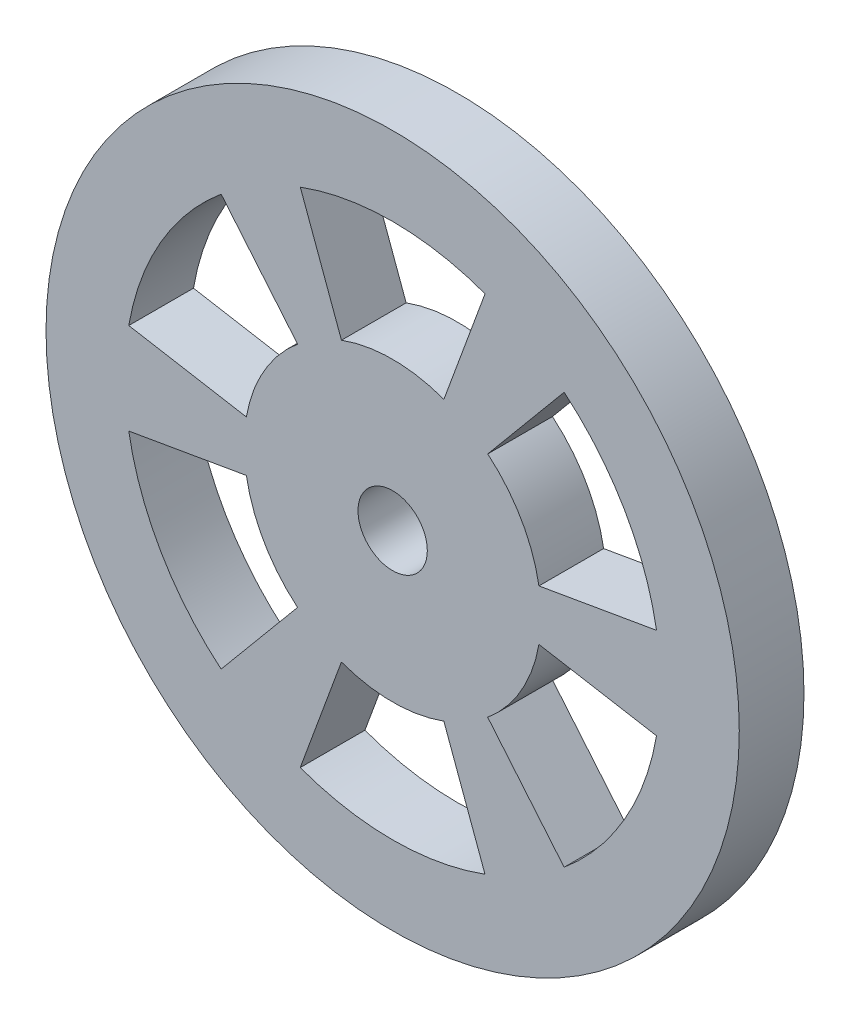
ISO-10303-21;
HEADER;
FILE_DESCRIPTION(('STEP AP214'),'2;1');
FILE_NAME('part.step','',(''),(''),'','','');
FILE_SCHEMA(('AUTOMOTIVE_DESIGN { 1 0 10303 214 1 1 1 1 }'));
ENDSEC;
DATA;
#1=APPLICATION_CONTEXT('core data for automotive mechanical design processes');
#2=APPLICATION_PROTOCOL_DEFINITION('international standard','automotive_design',2000,#1);
#3=PRODUCT_CONTEXT('',#1,'mechanical');
#4=PRODUCT('Part','Part','',(#3));
#5=PRODUCT_RELATED_PRODUCT_CATEGORY('part','',(#4));
#6=PRODUCT_DEFINITION_FORMATION('','',#4);
#7=PRODUCT_DEFINITION_CONTEXT('part definition',#1,'design');
#8=PRODUCT_DEFINITION('design','',#6,#7);
#9=PRODUCT_DEFINITION_SHAPE('','',#8);
#10=(LENGTH_UNIT() NAMED_UNIT(*) SI_UNIT(.MILLI.,.METRE.));
#11=(NAMED_UNIT(*) PLANE_ANGLE_UNIT() SI_UNIT($,.RADIAN.));
#12=(NAMED_UNIT(*) SI_UNIT($,.STERADIAN.) SOLID_ANGLE_UNIT());
#13=UNCERTAINTY_MEASURE_WITH_UNIT(LENGTH_MEASURE(1.E-05),#10,'distance_accuracy_value','');
#14=(GEOMETRIC_REPRESENTATION_CONTEXT(3) GLOBAL_UNCERTAINTY_ASSIGNED_CONTEXT((#13)) GLOBAL_UNIT_ASSIGNED_CONTEXT((#10,
#11,#12)) REPRESENTATION_CONTEXT('',''));
#15=CARTESIAN_POINT('',(0.,0.,0.));
#16=DIRECTION('',(0.,0.,1.));
#17=DIRECTION('',(1.,0.,0.));
#18=AXIS2_PLACEMENT_3D('',#15,#16,#17);
#19=CARTESIAN_POINT('',(193.744947860508,109.903151878288,2.8));
#20=DIRECTION('',(0.,0.,1.));
#21=DIRECTION('',(1.,0.,0.));
#22=AXIS2_PLACEMENT_3D('',#19,#20,#21);
#23=PLANE('',#22);
#24=CARTESIAN_POINT('',(193.744947860508,109.903151878288,2.8));
#25=DIRECTION('',(0.,0.,1.));
#26=DIRECTION('',(1.,0.,0.));
#27=AXIS2_PLACEMENT_3D('',#24,#25,#26);
#28=CIRCLE('',#27,15.);
#29=CARTESIAN_POINT('',(208.744947860508,109.903151878288,2.8));
#30=VERTEX_POINT('',#29);
#31=EDGE_CURVE('E11',#30,#30,#28,.T.);
#32=ORIENTED_EDGE('',*,*,#31,.T.);
#33=EDGE_LOOP('',(#32));
#34=FACE_BOUND('',#33,.T.);
#35=CARTESIAN_POINT('',(193.744947860508,109.903151878288,2.8));
#36=DIRECTION('',(0.,0.,1.));
#37=DIRECTION('',(1.,0.,0.));
#38=AXIS2_PLACEMENT_3D('',#35,#36,#37);
#39=CIRCLE('',#38,1.5);
#40=CARTESIAN_POINT('',(195.244947860508,109.903151878288,2.8));
#41=VERTEX_POINT('',#40);
#42=EDGE_CURVE('E388',#41,#41,#39,.T.);
#43=ORIENTED_EDGE('',*,*,#42,.F.);
#44=EDGE_LOOP('',(#43));
#45=FACE_BOUND('',#44,.T.);
#46=DIRECTION('',(-0.985365515869273,-0.170454686458545,0.));
#47=VECTOR('',#46,1.);
#48=CARTESIAN_POINT('',(182.325735882534,107.927785208802,2.8));
#49=LINE('',#48,#47);
#50=CARTESIAN_POINT('',(187.414773771405,108.808118794414,2.8));
#51=VERTEX_POINT('',#50);
#52=CARTESIAN_POINT('',(182.325735882534,107.927785208802,2.8));
#53=VERTEX_POINT('',#52);
#54=EDGE_CURVE('E359',#51,#53,#49,.T.);
#55=ORIENTED_EDGE('',*,*,#54,.F.);
#56=CARTESIAN_POINT('',(193.744947860508,109.903151878288,2.8));
#57=DIRECTION('',(0.,0.,-1.));
#58=DIRECTION('',(1.,0.,0.));
#59=AXIS2_PLACEMENT_3D('',#56,#57,#58);
#60=CIRCLE('',#59,6.42418877782505);
#61=CARTESIAN_POINT('',(189.630358850804,104.969556968453,2.8));
#62=VERTEX_POINT('',#61);
#63=EDGE_CURVE('E357',#62,#51,#60,.T.);
#64=ORIENTED_EDGE('',*,*,#63,.F.);
#65=DIRECTION('',(0.640483826363694,0.767971658439634,0.));
#66=VECTOR('',#65,1.);
#67=CARTESIAN_POINT('',(186.322503636591,101.003275619616,2.8));
#68=LINE('',#67,#66);
#69=CARTESIAN_POINT('',(186.322503636591,101.003275619616,2.8));
#70=VERTEX_POINT('',#69);
#71=EDGE_CURVE('E365',#70,#62,#68,.T.);
#72=ORIENTED_EDGE('',*,*,#71,.F.);
#73=CARTESIAN_POINT('',(193.744947860508,109.903151878288,2.8));
#74=DIRECTION('',(0.,0.,1.));
#75=DIRECTION('',(1.,0.,0.));
#76=AXIS2_PLACEMENT_3D('',#73,#74,#75);
#77=CIRCLE('',#76,11.5888082077856);
#78=EDGE_CURVE('E362',#53,#70,#77,.T.);
#79=ORIENTED_EDGE('',*,*,#78,.F.);
#80=EDGE_LOOP('',(#55,#64,#72,#79));
#81=FACE_BOUND('',#80,.T.);
#82=DIRECTION('',(-0.345064669267451,-0.938578911985212,0.));
#83=VECTOR('',#82,1.);
#84=CARTESIAN_POINT('',(189.746059589085,99.0261408794196,2.8));
#85=LINE('',#84,#83);
#86=CARTESIAN_POINT('',(191.528187284576,103.87354376481,2.8));
#87=VERTEX_POINT('',#86);
#88=CARTESIAN_POINT('',(189.746059589085,99.0261408794196,2.8));
#89=VERTEX_POINT('',#88);
#90=EDGE_CURVE('E328',#87,#89,#85,.T.);
#91=ORIENTED_EDGE('',*,*,#90,.F.);
#92=CARTESIAN_POINT('',(193.744947860508,109.903151878288,2.8));
#93=DIRECTION('',(0.,0.,-1.));
#94=DIRECTION('',(1.,0.,0.));
#95=AXIS2_PLACEMENT_3D('',#92,#93,#94);
#96=CIRCLE('',#95,6.42418877782508);
#97=CARTESIAN_POINT('',(195.960271879556,103.873015814835,2.8));
#98=VERTEX_POINT('',#97);
#99=EDGE_CURVE('E326',#98,#87,#96,.T.);
#100=ORIENTED_EDGE('',*,*,#99,.F.);
#101=DIRECTION('',(-0.344841052413365,0.938661093563829,0.));
#102=VECTOR('',#101,1.);
#103=CARTESIAN_POINT('',(197.741244679098,99.0251884928668,2.8));
#104=LINE('',#103,#102);
#105=CARTESIAN_POINT('',(197.741244679098,99.0251884928668,2.8));
#106=VERTEX_POINT('',#105);
#107=EDGE_CURVE('E334',#106,#98,#104,.T.);
#108=ORIENTED_EDGE('',*,*,#107,.F.);
#109=CARTESIAN_POINT('',(193.744947860508,109.903151878288,2.8));
#110=DIRECTION('',(0.,0.,1.));
#111=DIRECTION('',(1.,0.,0.));
#112=AXIS2_PLACEMENT_3D('',#109,#110,#111);
#113=CIRCLE('',#112,11.5888082077856);
#114=EDGE_CURVE('E331',#89,#106,#113,.T.);
#115=ORIENTED_EDGE('',*,*,#114,.F.);
#116=EDGE_LOOP('',(#91,#100,#108,#115));
#117=FACE_BOUND('',#116,.T.);
#118=DIRECTION('',(0.985324878777035,-0.170689435124205,0.));
#119=VECTOR('',#118,1.);
#120=CARTESIAN_POINT('',(182.326206818002,111.881239005038,2.8));
#121=LINE('',#120,#119);
#122=CARTESIAN_POINT('',(182.326206818002,111.881239005038,2.8));
#123=VERTEX_POINT('',#122);
#124=CARTESIAN_POINT('',(187.415034831757,110.999693031907,2.8));
#125=VERTEX_POINT('',#124);
#126=EDGE_CURVE('E297',#123,#125,#121,.T.);
#127=ORIENTED_EDGE('',*,*,#126,.F.);
#128=CARTESIAN_POINT('',(193.744947860508,109.903151878288,2.8));
#129=DIRECTION('',(0.,0.,1.));
#130=DIRECTION('',(1.,0.,0.));
#131=AXIS2_PLACEMENT_3D('',#128,#129,#130);
#132=CIRCLE('',#131,11.5888082077856);
#133=CARTESIAN_POINT('',(186.324624153957,118.804796207671,2.8));
#134=VERTEX_POINT('',#133);
#135=EDGE_CURVE('E295',#134,#123,#132,.T.);
#136=ORIENTED_EDGE('',*,*,#135,.F.);
#137=DIRECTION('',(-0.640300846601812,0.768124225526707,0.));
#138=VECTOR('',#137,1.);
#139=CARTESIAN_POINT('',(186.324624153957,118.804796207671,2.8));
#140=LINE('',#139,#138);
#141=CARTESIAN_POINT('',(189.631534347337,114.837726907893,2.8));
#142=VERTEX_POINT('',#141);
#143=EDGE_CURVE('E303',#142,#134,#140,.T.);
#144=ORIENTED_EDGE('',*,*,#143,.F.);
#145=CARTESIAN_POINT('',(193.744947860508,109.903151878288,2.8));
#146=DIRECTION('',(0.,0.,-1.));
#147=DIRECTION('',(1.,0.,0.));
#148=AXIS2_PLACEMENT_3D('',#145,#146,#147);
#149=CIRCLE('',#148,6.42418877782508);
#150=EDGE_CURVE('E300',#125,#142,#149,.T.);
#151=ORIENTED_EDGE('',*,*,#150,.F.);
#152=EDGE_LOOP('',(#127,#136,#144,#151));
#153=FACE_BOUND('',#152,.T.);
#154=DIRECTION('',(0.640300846601813,-0.768124225526706,0.));
#155=VECTOR('',#154,1.);
#156=CARTESIAN_POINT('',(201.165271567059,101.001507548905,2.8));
#157=LINE('',#156,#155);
#158=CARTESIAN_POINT('',(197.85836137368,104.968576848684,2.8));
#159=VERTEX_POINT('',#158);
#160=CARTESIAN_POINT('',(201.165271567059,101.001507548905,2.8));
#161=VERTEX_POINT('',#160);
#162=EDGE_CURVE('E266',#159,#161,#157,.T.);
#163=ORIENTED_EDGE('',*,*,#162,.F.);
#164=CARTESIAN_POINT('',(193.744947860508,109.903151878288,2.8));
#165=DIRECTION('',(0.,0.,-1.));
#166=DIRECTION('',(1.,0.,0.));
#167=AXIS2_PLACEMENT_3D('',#164,#165,#166);
#168=CIRCLE('',#167,6.42418877782506);
#169=CARTESIAN_POINT('',(200.07486088926,108.80661072467,2.8));
#170=VERTEX_POINT('',#169);
#171=EDGE_CURVE('E264',#170,#159,#168,.T.);
#172=ORIENTED_EDGE('',*,*,#171,.F.);
#173=DIRECTION('',(-0.985324878777035,0.170689435124207,0.));
#174=VECTOR('',#173,1.);
#175=CARTESIAN_POINT('',(205.163688903015,107.925064751539,2.8));
#176=LINE('',#175,#174);
#177=CARTESIAN_POINT('',(205.163688903015,107.925064751539,2.8));
#178=VERTEX_POINT('',#177);
#179=EDGE_CURVE('E272',#178,#170,#176,.T.);
#180=ORIENTED_EDGE('',*,*,#179,.F.);
#181=CARTESIAN_POINT('',(193.744947860508,109.903151878288,2.8));
#182=DIRECTION('',(0.,0.,1.));
#183=DIRECTION('',(1.,0.,0.));
#184=AXIS2_PLACEMENT_3D('',#181,#182,#183);
#185=CIRCLE('',#184,11.5888082077856);
#186=EDGE_CURVE('E269',#161,#178,#185,.T.);
#187=ORIENTED_EDGE('',*,*,#186,.F.);
#188=EDGE_LOOP('',(#163,#172,#180,#187));
#189=FACE_BOUND('',#188,.T.);
#190=DIRECTION('',(-0.640483826363693,-0.767971658439634,0.));
#191=VECTOR('',#190,1.);
#192=CARTESIAN_POINT('',(201.167392084426,118.80302813696,2.8));
#193=LINE('',#192,#191);
#194=CARTESIAN_POINT('',(201.167392084426,118.80302813696,2.8));
#195=VERTEX_POINT('',#194);
#196=CARTESIAN_POINT('',(197.859536870212,114.836746788124,2.8));
#197=VERTEX_POINT('',#196);
#198=EDGE_CURVE('E235',#195,#197,#193,.T.);
#199=ORIENTED_EDGE('',*,*,#198,.F.);
#200=CARTESIAN_POINT('',(193.744947860508,109.903151878288,2.8));
#201=DIRECTION('',(0.,0.,1.));
#202=DIRECTION('',(1.,0.,0.));
#203=AXIS2_PLACEMENT_3D('',#200,#201,#202);
#204=CIRCLE('',#203,11.5888082077856);
#205=CARTESIAN_POINT('',(205.164159838483,111.878518547775,2.8));
#206=VERTEX_POINT('',#205);
#207=EDGE_CURVE('E233',#206,#195,#204,.T.);
#208=ORIENTED_EDGE('',*,*,#207,.F.);
#209=DIRECTION('',(0.985365515869273,0.170454686458545,0.));
#210=VECTOR('',#209,1.);
#211=CARTESIAN_POINT('',(205.164159838483,111.878518547775,2.8));
#212=LINE('',#211,#210);
#213=CARTESIAN_POINT('',(200.075121949611,110.998184962163,2.8));
#214=VERTEX_POINT('',#213);
#215=EDGE_CURVE('E241',#214,#206,#212,.T.);
#216=ORIENTED_EDGE('',*,*,#215,.F.);
#217=CARTESIAN_POINT('',(193.744947860508,109.903151878288,2.8));
#218=DIRECTION('',(0.,0.,-1.));
#219=DIRECTION('',(1.,0.,0.));
#220=AXIS2_PLACEMENT_3D('',#217,#218,#219);
#221=CIRCLE('',#220,6.42418877782508);
#222=EDGE_CURVE('E238',#197,#214,#221,.T.);
#223=ORIENTED_EDGE('',*,*,#222,.F.);
#224=EDGE_LOOP('',(#199,#208,#216,#223));
#225=FACE_BOUND('',#224,.T.);
#226=DIRECTION('',(0.344841052413366,-0.938661093563828,0.));
#227=VECTOR('',#226,1.);
#228=CARTESIAN_POINT('',(189.748651041919,120.78111526371,2.8));
#229=LINE('',#228,#227);
#230=CARTESIAN_POINT('',(189.748651041919,120.78111526371,2.8));
#231=VERTEX_POINT('',#230);
#232=CARTESIAN_POINT('',(191.529623841461,115.933287941742,2.8));
#233=VERTEX_POINT('',#232);
#234=EDGE_CURVE('E205',#231,#233,#229,.T.);
#235=ORIENTED_EDGE('',*,*,#234,.F.);
#236=CARTESIAN_POINT('',(193.744947860508,109.903151878288,2.8));
#237=DIRECTION('',(0.,0.,1.));
#238=DIRECTION('',(1.,0.,0.));
#239=AXIS2_PLACEMENT_3D('',#236,#237,#238);
#240=CIRCLE('',#239,11.5888082077856);
#241=CARTESIAN_POINT('',(197.743836131932,120.780162877157,2.8));
#242=VERTEX_POINT('',#241);
#243=EDGE_CURVE('E197',#242,#231,#240,.T.);
#244=ORIENTED_EDGE('',*,*,#243,.F.);
#245=DIRECTION('',(0.34506466926745,0.938578911985212,0.));
#246=VECTOR('',#245,1.);
#247=CARTESIAN_POINT('',(197.743836131932,120.780162877157,2.8));
#248=LINE('',#247,#246);
#249=CARTESIAN_POINT('',(195.96170843644,115.932759991767,2.8));
#250=VERTEX_POINT('',#249);
#251=EDGE_CURVE('E219',#250,#242,#248,.T.);
#252=ORIENTED_EDGE('',*,*,#251,.F.);
#253=CARTESIAN_POINT('',(193.744947860508,109.903151878288,2.8));
#254=DIRECTION('',(0.,0.,-1.));
#255=DIRECTION('',(1.,0.,0.));
#256=AXIS2_PLACEMENT_3D('',#253,#254,#255);
#257=CIRCLE('',#256,6.4241887778251);
#258=EDGE_CURVE('E217',#233,#250,#257,.T.);
#259=ORIENTED_EDGE('',*,*,#258,.F.);
#260=EDGE_LOOP('',(#235,#244,#252,#259));
#261=FACE_BOUND('',#260,.T.);
#262=ADVANCED_FACE('F36',(#34,#45,#81,#117,#153,#189,#225,#261),#23,.T.);
#263=CARTESIAN_POINT('',(193.744947860508,109.903151878288,0.));
#264=DIRECTION('',(0.,0.,1.));
#265=DIRECTION('',(1.,0.,0.));
#266=AXIS2_PLACEMENT_3D('',#263,#264,#265);
#267=PLANE('',#266);
#268=CARTESIAN_POINT('',(193.744947860508,109.903151878288,0.));
#269=DIRECTION('',(0.,0.,1.));
#270=DIRECTION('',(1.,0.,0.));
#271=AXIS2_PLACEMENT_3D('',#268,#269,#270);
#272=CIRCLE('',#271,11.5888082077856);
#273=CARTESIAN_POINT('',(205.164159838483,111.878518547775,0.));
#274=VERTEX_POINT('',#273);
#275=CARTESIAN_POINT('',(201.167392084426,118.80302813696,0.));
#276=VERTEX_POINT('',#275);
#277=EDGE_CURVE('E213',#274,#276,#272,.T.);
#278=ORIENTED_EDGE('',*,*,#277,.T.);
#279=DIRECTION('',(-0.640483826363693,-0.767971658439634,0.));
#280=VECTOR('',#279,1.);
#281=CARTESIAN_POINT('',(201.167392084426,118.80302813696,0.));
#282=LINE('',#281,#280);
#283=CARTESIAN_POINT('',(197.859536870212,114.836746788124,0.));
#284=VERTEX_POINT('',#283);
#285=EDGE_CURVE('E246',#276,#284,#282,.T.);
#286=ORIENTED_EDGE('',*,*,#285,.T.);
#287=CARTESIAN_POINT('',(193.744947860508,109.903151878288,0.));
#288=DIRECTION('',(0.,0.,-1.));
#289=DIRECTION('',(1.,0.,0.));
#290=AXIS2_PLACEMENT_3D('',#287,#288,#289);
#291=CIRCLE('',#290,6.42418877782508);
#292=CARTESIAN_POINT('',(200.075121949611,110.998184962163,0.));
#293=VERTEX_POINT('',#292);
#294=EDGE_CURVE('E249',#284,#293,#291,.T.);
#295=ORIENTED_EDGE('',*,*,#294,.T.);
#296=DIRECTION('',(0.985365515869273,0.170454686458545,0.));
#297=VECTOR('',#296,1.);
#298=CARTESIAN_POINT('',(205.164159838483,111.878518547775,0.));
#299=LINE('',#298,#297);
#300=EDGE_CURVE('E236',#293,#274,#299,.T.);
#301=ORIENTED_EDGE('',*,*,#300,.T.);
#302=EDGE_LOOP('',(#278,#286,#295,#301));
#303=FACE_BOUND('',#302,.T.);
#304=CARTESIAN_POINT('',(193.744947860508,109.903151878288,0.));
#305=DIRECTION('',(0.,0.,1.));
#306=DIRECTION('',(1.,0.,0.));
#307=AXIS2_PLACEMENT_3D('',#304,#305,#306);
#308=CIRCLE('',#307,11.5888082077856);
#309=CARTESIAN_POINT('',(186.324624153957,118.804796207671,0.));
#310=VERTEX_POINT('',#309);
#311=CARTESIAN_POINT('',(182.326206818002,111.881239005038,0.));
#312=VERTEX_POINT('',#311);
#313=EDGE_CURVE('E294',#310,#312,#308,.T.);
#314=ORIENTED_EDGE('',*,*,#313,.T.);
#315=DIRECTION('',(0.985324878777035,-0.170689435124205,0.));
#316=VECTOR('',#315,1.);
#317=CARTESIAN_POINT('',(182.326206818002,111.881239005038,0.));
#318=LINE('',#317,#316);
#319=CARTESIAN_POINT('',(187.415034831757,110.999693031907,0.));
#320=VERTEX_POINT('',#319);
#321=EDGE_CURVE('E308',#312,#320,#318,.T.);
#322=ORIENTED_EDGE('',*,*,#321,.T.);
#323=CARTESIAN_POINT('',(193.744947860508,109.903151878288,0.));
#324=DIRECTION('',(0.,0.,-1.));
#325=DIRECTION('',(1.,0.,0.));
#326=AXIS2_PLACEMENT_3D('',#323,#324,#325);
#327=CIRCLE('',#326,6.42418877782508);
#328=CARTESIAN_POINT('',(189.631534347337,114.837726907893,0.));
#329=VERTEX_POINT('',#328);
#330=EDGE_CURVE('E311',#320,#329,#327,.T.);
#331=ORIENTED_EDGE('',*,*,#330,.T.);
#332=DIRECTION('',(-0.640300846601812,0.768124225526707,0.));
#333=VECTOR('',#332,1.);
#334=CARTESIAN_POINT('',(186.324624153957,118.804796207671,0.));
#335=LINE('',#334,#333);
#336=EDGE_CURVE('E298',#329,#310,#335,.T.);
#337=ORIENTED_EDGE('',*,*,#336,.T.);
#338=EDGE_LOOP('',(#314,#322,#331,#337));
#339=FACE_BOUND('',#338,.T.);
#340=CARTESIAN_POINT('',(193.744947860508,109.903151878288,0.));
#341=DIRECTION('',(0.,0.,-1.));
#342=DIRECTION('',(1.,0.,0.));
#343=AXIS2_PLACEMENT_3D('',#340,#341,#342);
#344=CIRCLE('',#343,6.42418877782505);
#345=CARTESIAN_POINT('',(189.630358850804,104.969556968453,0.));
#346=VERTEX_POINT('',#345);
#347=CARTESIAN_POINT('',(187.414773771405,108.808118794414,0.));
#348=VERTEX_POINT('',#347);
#349=EDGE_CURVE('E356',#346,#348,#344,.T.);
#350=ORIENTED_EDGE('',*,*,#349,.T.);
#351=DIRECTION('',(-0.985365515869273,-0.170454686458545,0.));
#352=VECTOR('',#351,1.);
#353=CARTESIAN_POINT('',(182.325735882534,107.927785208802,0.));
#354=LINE('',#353,#352);
#355=CARTESIAN_POINT('',(182.325735882534,107.927785208802,0.));
#356=VERTEX_POINT('',#355);
#357=EDGE_CURVE('E370',#348,#356,#354,.T.);
#358=ORIENTED_EDGE('',*,*,#357,.T.);
#359=CARTESIAN_POINT('',(193.744947860508,109.903151878288,0.));
#360=DIRECTION('',(0.,0.,1.));
#361=DIRECTION('',(1.,0.,0.));
#362=AXIS2_PLACEMENT_3D('',#359,#360,#361);
#363=CIRCLE('',#362,11.5888082077856);
#364=CARTESIAN_POINT('',(186.322503636591,101.003275619616,0.));
#365=VERTEX_POINT('',#364);
#366=EDGE_CURVE('E373',#356,#365,#363,.T.);
#367=ORIENTED_EDGE('',*,*,#366,.T.);
#368=DIRECTION('',(0.640483826363694,0.767971658439634,0.));
#369=VECTOR('',#368,1.);
#370=CARTESIAN_POINT('',(186.322503636591,101.003275619616,0.));
#371=LINE('',#370,#369);
#372=EDGE_CURVE('E360',#365,#346,#371,.T.);
#373=ORIENTED_EDGE('',*,*,#372,.T.);
#374=EDGE_LOOP('',(#350,#358,#367,#373));
#375=FACE_BOUND('',#374,.T.);
#376=CARTESIAN_POINT('',(193.744947860508,109.903151878288,0.));
#377=DIRECTION('',(0.,0.,1.));
#378=DIRECTION('',(1.,0.,0.));
#379=AXIS2_PLACEMENT_3D('',#376,#377,#378);
#380=CIRCLE('',#379,15.);
#381=CARTESIAN_POINT('',(208.744947860508,109.903151878288,0.));
#382=VERTEX_POINT('',#381);
#383=EDGE_CURVE('E40',#382,#382,#380,.T.);
#384=ORIENTED_EDGE('',*,*,#383,.F.);
#385=EDGE_LOOP('',(#384));
#386=FACE_BOUND('',#385,.T.);
#387=CARTESIAN_POINT('',(193.744947860508,109.903151878288,0.));
#388=DIRECTION('',(0.,0.,1.));
#389=DIRECTION('',(1.,0.,0.));
#390=AXIS2_PLACEMENT_3D('',#387,#388,#389);
#391=CIRCLE('',#390,1.5);
#392=CARTESIAN_POINT('',(195.244947860508,109.903151878288,0.));
#393=VERTEX_POINT('',#392);
#394=EDGE_CURVE('E387',#393,#393,#391,.T.);
#395=ORIENTED_EDGE('',*,*,#394,.T.);
#396=EDGE_LOOP('',(#395));
#397=FACE_BOUND('',#396,.T.);
#398=CARTESIAN_POINT('',(193.744947860508,109.903151878288,0.));
#399=DIRECTION('',(0.,0.,-1.));
#400=DIRECTION('',(1.,0.,0.));
#401=AXIS2_PLACEMENT_3D('',#398,#399,#400);
#402=CIRCLE('',#401,6.42418877782508);
#403=CARTESIAN_POINT('',(195.960271879556,103.873015814835,0.));
#404=VERTEX_POINT('',#403);
#405=CARTESIAN_POINT('',(191.528187284576,103.87354376481,0.));
#406=VERTEX_POINT('',#405);
#407=EDGE_CURVE('E325',#404,#406,#402,.T.);
#408=ORIENTED_EDGE('',*,*,#407,.T.);
#409=DIRECTION('',(-0.345064669267451,-0.938578911985212,0.));
#410=VECTOR('',#409,1.);
#411=CARTESIAN_POINT('',(189.746059589085,99.0261408794196,0.));
#412=LINE('',#411,#410);
#413=CARTESIAN_POINT('',(189.746059589085,99.0261408794196,0.));
#414=VERTEX_POINT('',#413);
#415=EDGE_CURVE('E339',#406,#414,#412,.T.);
#416=ORIENTED_EDGE('',*,*,#415,.T.);
#417=CARTESIAN_POINT('',(193.744947860508,109.903151878288,0.));
#418=DIRECTION('',(0.,0.,1.));
#419=DIRECTION('',(1.,0.,0.));
#420=AXIS2_PLACEMENT_3D('',#417,#418,#419);
#421=CIRCLE('',#420,11.5888082077856);
#422=CARTESIAN_POINT('',(197.741244679098,99.0251884928668,0.));
#423=VERTEX_POINT('',#422);
#424=EDGE_CURVE('E342',#414,#423,#421,.T.);
#425=ORIENTED_EDGE('',*,*,#424,.T.);
#426=DIRECTION('',(-0.344841052413365,0.938661093563829,0.));
#427=VECTOR('',#426,1.);
#428=CARTESIAN_POINT('',(197.741244679098,99.0251884928668,0.));
#429=LINE('',#428,#427);
#430=EDGE_CURVE('E329',#423,#404,#429,.T.);
#431=ORIENTED_EDGE('',*,*,#430,.T.);
#432=EDGE_LOOP('',(#408,#416,#425,#431));
#433=FACE_BOUND('',#432,.T.);
#434=CARTESIAN_POINT('',(193.744947860508,109.903151878288,0.));
#435=DIRECTION('',(0.,0.,-1.));
#436=DIRECTION('',(1.,0.,0.));
#437=AXIS2_PLACEMENT_3D('',#434,#435,#436);
#438=CIRCLE('',#437,6.42418877782506);
#439=CARTESIAN_POINT('',(200.07486088926,108.80661072467,0.));
#440=VERTEX_POINT('',#439);
#441=CARTESIAN_POINT('',(197.85836137368,104.968576848684,0.));
#442=VERTEX_POINT('',#441);
#443=EDGE_CURVE('E263',#440,#442,#438,.T.);
#444=ORIENTED_EDGE('',*,*,#443,.T.);
#445=DIRECTION('',(0.640300846601813,-0.768124225526706,0.));
#446=VECTOR('',#445,1.);
#447=CARTESIAN_POINT('',(201.165271567059,101.001507548905,0.));
#448=LINE('',#447,#446);
#449=CARTESIAN_POINT('',(201.165271567059,101.001507548905,0.));
#450=VERTEX_POINT('',#449);
#451=EDGE_CURVE('E277',#442,#450,#448,.T.);
#452=ORIENTED_EDGE('',*,*,#451,.T.);
#453=CARTESIAN_POINT('',(193.744947860508,109.903151878288,0.));
#454=DIRECTION('',(0.,0.,1.));
#455=DIRECTION('',(1.,0.,0.));
#456=AXIS2_PLACEMENT_3D('',#453,#454,#455);
#457=CIRCLE('',#456,11.5888082077856);
#458=CARTESIAN_POINT('',(205.163688903015,107.925064751539,0.));
#459=VERTEX_POINT('',#458);
#460=EDGE_CURVE('E280',#450,#459,#457,.T.);
#461=ORIENTED_EDGE('',*,*,#460,.T.);
#462=DIRECTION('',(-0.985324878777035,0.170689435124207,0.));
#463=VECTOR('',#462,1.);
#464=CARTESIAN_POINT('',(205.163688903015,107.925064751539,0.));
#465=LINE('',#464,#463);
#466=EDGE_CURVE('E267',#459,#440,#465,.T.);
#467=ORIENTED_EDGE('',*,*,#466,.T.);
#468=EDGE_LOOP('',(#444,#452,#461,#467));
#469=FACE_BOUND('',#468,.T.);
#470=CARTESIAN_POINT('',(193.744947860508,109.903151878288,0.));
#471=DIRECTION('',(0.,0.,1.));
#472=DIRECTION('',(1.,0.,0.));
#473=AXIS2_PLACEMENT_3D('',#470,#471,#472);
#474=CIRCLE('',#473,11.5888082077856);
#475=CARTESIAN_POINT('',(197.743836131932,120.780162877157,0.));
#476=VERTEX_POINT('',#475);
#477=CARTESIAN_POINT('',(189.748651041919,120.78111526371,0.));
#478=VERTEX_POINT('',#477);
#479=EDGE_CURVE('E59',#476,#478,#474,.T.);
#480=ORIENTED_EDGE('',*,*,#479,.T.);
#481=DIRECTION('',(0.344841052413366,-0.938661093563828,0.));
#482=VECTOR('',#481,1.);
#483=CARTESIAN_POINT('',(189.748651041919,120.78111526371,0.));
#484=LINE('',#483,#482);
#485=CARTESIAN_POINT('',(191.529623841461,115.933287941742,0.));
#486=VERTEX_POINT('',#485);
#487=EDGE_CURVE('E212',#478,#486,#484,.T.);
#488=ORIENTED_EDGE('',*,*,#487,.T.);
#489=CARTESIAN_POINT('',(193.744947860508,109.903151878288,0.));
#490=DIRECTION('',(0.,0.,-1.));
#491=DIRECTION('',(1.,0.,0.));
#492=AXIS2_PLACEMENT_3D('',#489,#490,#491);
#493=CIRCLE('',#492,6.4241887778251);
#494=CARTESIAN_POINT('',(195.96170843644,115.932759991767,0.));
#495=VERTEX_POINT('',#494);
#496=EDGE_CURVE('E225',#486,#495,#493,.T.);
#497=ORIENTED_EDGE('',*,*,#496,.T.);
#498=DIRECTION('',(0.34506466926745,0.938578911985212,0.));
#499=VECTOR('',#498,1.);
#500=CARTESIAN_POINT('',(197.743836131932,120.780162877157,0.));
#501=LINE('',#500,#499);
#502=EDGE_CURVE('E206',#495,#476,#501,.T.);
#503=ORIENTED_EDGE('',*,*,#502,.T.);
#504=EDGE_LOOP('',(#480,#488,#497,#503));
#505=FACE_BOUND('',#504,.T.);
#506=ADVANCED_FACE('F394',(#303,#339,#375,#386,#397,#433,#469,#505),#267,.F.);
#507=CARTESIAN_POINT('',(193.744947860508,109.903151878288,2.8));
#508=DIRECTION('',(0.,0.,-1.));
#509=DIRECTION('',(-1.,0.,0.));
#510=AXIS2_PLACEMENT_3D('',#507,#508,#509);
#511=CYLINDRICAL_SURFACE('',#510,15.);
#512=ORIENTED_EDGE('',*,*,#31,.F.);
#513=EDGE_LOOP('',(#512));
#514=FACE_BOUND('',#513,.T.);
#515=ORIENTED_EDGE('',*,*,#383,.T.);
#516=EDGE_LOOP('',(#515));
#517=FACE_BOUND('',#516,.T.);
#518=ADVANCED_FACE('F38',(#514,#517),#511,.T.);
#519=CARTESIAN_POINT('',(193.744947860508,109.903151878288,2.8));
#520=DIRECTION('',(0.,0.,-1.));
#521=DIRECTION('',(-1.,0.,0.));
#522=AXIS2_PLACEMENT_3D('',#519,#520,#521);
#523=CYLINDRICAL_SURFACE('',#522,1.5);
#524=ORIENTED_EDGE('',*,*,#42,.T.);
#525=EDGE_LOOP('',(#524));
#526=FACE_BOUND('',#525,.T.);
#527=ORIENTED_EDGE('',*,*,#394,.F.);
#528=EDGE_LOOP('',(#527));
#529=FACE_BOUND('',#528,.T.);
#530=ADVANCED_FACE('F397',(#526,#529),#523,.F.);
#531=CARTESIAN_POINT('',(193.744947860508,109.903151878288,2.8));
#532=DIRECTION('',(0.,0.,-1.));
#533=DIRECTION('',(-1.,0.,0.));
#534=AXIS2_PLACEMENT_3D('',#531,#532,#533);
#535=CYLINDRICAL_SURFACE('',#534,6.42418877782505);
#536=ORIENTED_EDGE('',*,*,#349,.F.);
#537=DIRECTION('',(0.,0.,-1.));
#538=VECTOR('',#537,1.);
#539=CARTESIAN_POINT('',(189.630358850804,104.969556968453,2.8));
#540=LINE('',#539,#538);
#541=EDGE_CURVE('E367',#62,#346,#540,.T.);
#542=ORIENTED_EDGE('',*,*,#541,.F.);
#543=ORIENTED_EDGE('',*,*,#63,.T.);
#544=DIRECTION('',(0.,0.,-1.));
#545=VECTOR('',#544,1.);
#546=CARTESIAN_POINT('',(187.414773771405,108.808118794414,2.8));
#547=LINE('',#546,#545);
#548=EDGE_CURVE('E384',#51,#348,#547,.T.);
#549=ORIENTED_EDGE('',*,*,#548,.T.);
#550=EDGE_LOOP('',(#536,#542,#543,#549));
#551=FACE_BOUND('',#550,.T.);
#552=ADVANCED_FACE('F399',(#551),#535,.T.);
#553=CARTESIAN_POINT('',(182.325735882534,107.927785208802,2.8));
#554=DIRECTION('',(0.170454686458545,-0.985365515869273,0.));
#555=DIRECTION('',(0.985365515869273,0.170454686458545,0.));
#556=AXIS2_PLACEMENT_3D('',#553,#554,#555);
#557=PLANE('',#556);
#558=ORIENTED_EDGE('',*,*,#357,.F.);
#559=ORIENTED_EDGE('',*,*,#548,.F.);
#560=ORIENTED_EDGE('',*,*,#54,.T.);
#561=DIRECTION('',(0.,0.,-1.));
#562=VECTOR('',#561,1.);
#563=CARTESIAN_POINT('',(182.325735882534,107.927785208802,2.8));
#564=LINE('',#563,#562);
#565=EDGE_CURVE('E382',#53,#356,#564,.T.);
#566=ORIENTED_EDGE('',*,*,#565,.T.);
#567=EDGE_LOOP('',(#558,#559,#560,#566));
#568=FACE_BOUND('',#567,.T.);
#569=ADVANCED_FACE('F406',(#568),#557,.T.);
#570=CARTESIAN_POINT('',(193.744947860508,109.903151878288,2.8));
#571=DIRECTION('',(0.,0.,-1.));
#572=DIRECTION('',(-1.,0.,0.));
#573=AXIS2_PLACEMENT_3D('',#570,#571,#572);
#574=CYLINDRICAL_SURFACE('',#573,11.5888082077856);
#575=ORIENTED_EDGE('',*,*,#366,.F.);
#576=ORIENTED_EDGE('',*,*,#565,.F.);
#577=ORIENTED_EDGE('',*,*,#78,.T.);
#578=DIRECTION('',(0.,0.,-1.));
#579=VECTOR('',#578,1.);
#580=CARTESIAN_POINT('',(186.322503636591,101.003275619616,2.8));
#581=LINE('',#580,#579);
#582=EDGE_CURVE('E380',#70,#365,#581,.T.);
#583=ORIENTED_EDGE('',*,*,#582,.T.);
#584=EDGE_LOOP('',(#575,#576,#577,#583));
#585=FACE_BOUND('',#584,.T.);
#586=ADVANCED_FACE('F520',(#585),#574,.F.);
#587=CARTESIAN_POINT('',(186.322503636591,101.003275619616,2.8));
#588=DIRECTION('',(-0.767971658439634,0.640483826363694,0.));
#589=DIRECTION('',(-0.640483826363694,-0.767971658439634,0.));
#590=AXIS2_PLACEMENT_3D('',#587,#588,#589);
#591=PLANE('',#590);
#592=ORIENTED_EDGE('',*,*,#372,.F.);
#593=ORIENTED_EDGE('',*,*,#582,.F.);
#594=ORIENTED_EDGE('',*,*,#71,.T.);
#595=ORIENTED_EDGE('',*,*,#541,.T.);
#596=EDGE_LOOP('',(#592,#593,#594,#595));
#597=FACE_BOUND('',#596,.T.);
#598=ADVANCED_FACE('F516',(#597),#591,.T.);
#599=CARTESIAN_POINT('',(193.744947860508,109.903151878288,2.8));
#600=DIRECTION('',(0.,0.,-1.));
#601=DIRECTION('',(-1.,0.,0.));
#602=AXIS2_PLACEMENT_3D('',#599,#600,#601);
#603=CYLINDRICAL_SURFACE('',#602,6.42418877782508);
#604=ORIENTED_EDGE('',*,*,#407,.F.);
#605=DIRECTION('',(0.,0.,-1.));
#606=VECTOR('',#605,1.);
#607=CARTESIAN_POINT('',(195.960271879556,103.873015814835,2.8));
#608=LINE('',#607,#606);
#609=EDGE_CURVE('E336',#98,#404,#608,.T.);
#610=ORIENTED_EDGE('',*,*,#609,.F.);
#611=ORIENTED_EDGE('',*,*,#99,.T.);
#612=DIRECTION('',(0.,0.,-1.));
#613=VECTOR('',#612,1.);
#614=CARTESIAN_POINT('',(191.528187284576,103.87354376481,2.8));
#615=LINE('',#614,#613);
#616=EDGE_CURVE('E353',#87,#406,#615,.T.);
#617=ORIENTED_EDGE('',*,*,#616,.T.);
#618=EDGE_LOOP('',(#604,#610,#611,#617));
#619=FACE_BOUND('',#618,.T.);
#620=ADVANCED_FACE('F512',(#619),#603,.T.);
#621=CARTESIAN_POINT('',(189.746059589085,99.0261408794196,2.8));
#622=DIRECTION('',(0.938578911985212,-0.345064669267451,0.));
#623=DIRECTION('',(0.345064669267451,0.938578911985212,0.));
#624=AXIS2_PLACEMENT_3D('',#621,#622,#623);
#625=PLANE('',#624);
#626=ORIENTED_EDGE('',*,*,#415,.F.);
#627=ORIENTED_EDGE('',*,*,#616,.F.);
#628=ORIENTED_EDGE('',*,*,#90,.T.);
#629=DIRECTION('',(0.,0.,-1.));
#630=VECTOR('',#629,1.);
#631=CARTESIAN_POINT('',(189.746059589085,99.0261408794196,2.8));
#632=LINE('',#631,#630);
#633=EDGE_CURVE('E351',#89,#414,#632,.T.);
#634=ORIENTED_EDGE('',*,*,#633,.T.);
#635=EDGE_LOOP('',(#626,#627,#628,#634));
#636=FACE_BOUND('',#635,.T.);
#637=ADVANCED_FACE('F508',(#636),#625,.T.);
#638=CARTESIAN_POINT('',(193.744947860508,109.903151878288,2.8));
#639=DIRECTION('',(0.,0.,-1.));
#640=DIRECTION('',(-1.,0.,0.));
#641=AXIS2_PLACEMENT_3D('',#638,#639,#640);
#642=CYLINDRICAL_SURFACE('',#641,11.5888082077856);
#643=ORIENTED_EDGE('',*,*,#424,.F.);
#644=ORIENTED_EDGE('',*,*,#633,.F.);
#645=ORIENTED_EDGE('',*,*,#114,.T.);
#646=DIRECTION('',(0.,0.,-1.));
#647=VECTOR('',#646,1.);
#648=CARTESIAN_POINT('',(197.741244679098,99.0251884928668,2.8));
#649=LINE('',#648,#647);
#650=EDGE_CURVE('E349',#106,#423,#649,.T.);
#651=ORIENTED_EDGE('',*,*,#650,.T.);
#652=EDGE_LOOP('',(#643,#644,#645,#651));
#653=FACE_BOUND('',#652,.T.);
#654=ADVANCED_FACE('F504',(#653),#642,.F.);
#655=CARTESIAN_POINT('',(197.741244679098,99.0251884928668,2.8));
#656=DIRECTION('',(-0.938661093563829,-0.344841052413365,0.));
#657=DIRECTION('',(0.344841052413365,-0.938661093563829,0.));
#658=AXIS2_PLACEMENT_3D('',#655,#656,#657);
#659=PLANE('',#658);
#660=ORIENTED_EDGE('',*,*,#430,.F.);
#661=ORIENTED_EDGE('',*,*,#650,.F.);
#662=ORIENTED_EDGE('',*,*,#107,.T.);
#663=ORIENTED_EDGE('',*,*,#609,.T.);
#664=EDGE_LOOP('',(#660,#661,#662,#663));
#665=FACE_BOUND('',#664,.T.);
#666=ADVANCED_FACE('F500',(#665),#659,.T.);
#667=CARTESIAN_POINT('',(193.744947860508,109.903151878288,2.8));
#668=DIRECTION('',(0.,0.,-1.));
#669=DIRECTION('',(-1.,0.,0.));
#670=AXIS2_PLACEMENT_3D('',#667,#668,#669);
#671=CYLINDRICAL_SURFACE('',#670,11.5888082077856);
#672=ORIENTED_EDGE('',*,*,#313,.F.);
#673=DIRECTION('',(0.,0.,-1.));
#674=VECTOR('',#673,1.);
#675=CARTESIAN_POINT('',(186.324624153957,118.804796207671,2.8));
#676=LINE('',#675,#674);
#677=EDGE_CURVE('E305',#134,#310,#676,.T.);
#678=ORIENTED_EDGE('',*,*,#677,.F.);
#679=ORIENTED_EDGE('',*,*,#135,.T.);
#680=DIRECTION('',(0.,0.,-1.));
#681=VECTOR('',#680,1.);
#682=CARTESIAN_POINT('',(182.326206818002,111.881239005038,2.8));
#683=LINE('',#682,#681);
#684=EDGE_CURVE('E322',#123,#312,#683,.T.);
#685=ORIENTED_EDGE('',*,*,#684,.T.);
#686=EDGE_LOOP('',(#672,#678,#679,#685));
#687=FACE_BOUND('',#686,.T.);
#688=ADVANCED_FACE('F496',(#687),#671,.F.);
#689=CARTESIAN_POINT('',(182.326206818002,111.881239005038,2.8));
#690=DIRECTION('',(0.170689435124205,0.985324878777036,0.));
#691=DIRECTION('',(-0.985324878777035,0.170689435124205,0.));
#692=AXIS2_PLACEMENT_3D('',#689,#690,#691);
#693=PLANE('',#692);
#694=ORIENTED_EDGE('',*,*,#321,.F.);
#695=ORIENTED_EDGE('',*,*,#684,.F.);
#696=ORIENTED_EDGE('',*,*,#126,.T.);
#697=DIRECTION('',(0.,0.,-1.));
#698=VECTOR('',#697,1.);
#699=CARTESIAN_POINT('',(187.415034831757,110.999693031907,2.8));
#700=LINE('',#699,#698);
#701=EDGE_CURVE('E320',#125,#320,#700,.T.);
#702=ORIENTED_EDGE('',*,*,#701,.T.);
#703=EDGE_LOOP('',(#694,#695,#696,#702));
#704=FACE_BOUND('',#703,.T.);
#705=ADVANCED_FACE('F492',(#704),#693,.T.);
#706=CARTESIAN_POINT('',(193.744947860508,109.903151878288,2.8));
#707=DIRECTION('',(0.,0.,-1.));
#708=DIRECTION('',(-1.,0.,0.));
#709=AXIS2_PLACEMENT_3D('',#706,#707,#708);
#710=CYLINDRICAL_SURFACE('',#709,6.42418877782508);
#711=ORIENTED_EDGE('',*,*,#330,.F.);
#712=ORIENTED_EDGE('',*,*,#701,.F.);
#713=ORIENTED_EDGE('',*,*,#150,.T.);
#714=DIRECTION('',(0.,0.,-1.));
#715=VECTOR('',#714,1.);
#716=CARTESIAN_POINT('',(189.631534347337,114.837726907893,2.8));
#717=LINE('',#716,#715);
#718=EDGE_CURVE('E318',#142,#329,#717,.T.);
#719=ORIENTED_EDGE('',*,*,#718,.T.);
#720=EDGE_LOOP('',(#711,#712,#713,#719));
#721=FACE_BOUND('',#720,.T.);
#722=ADVANCED_FACE('F488',(#721),#710,.T.);
#723=CARTESIAN_POINT('',(186.324624153957,118.804796207671,2.8));
#724=DIRECTION('',(-0.768124225526707,-0.640300846601812,0.));
#725=DIRECTION('',(0.640300846601812,-0.768124225526707,0.));
#726=AXIS2_PLACEMENT_3D('',#723,#724,#725);
#727=PLANE('',#726);
#728=ORIENTED_EDGE('',*,*,#336,.F.);
#729=ORIENTED_EDGE('',*,*,#718,.F.);
#730=ORIENTED_EDGE('',*,*,#143,.T.);
#731=ORIENTED_EDGE('',*,*,#677,.T.);
#732=EDGE_LOOP('',(#728,#729,#730,#731));
#733=FACE_BOUND('',#732,.T.);
#734=ADVANCED_FACE('F484',(#733),#727,.T.);
#735=CARTESIAN_POINT('',(193.744947860508,109.903151878288,2.8));
#736=DIRECTION('',(0.,0.,-1.));
#737=DIRECTION('',(-1.,0.,0.));
#738=AXIS2_PLACEMENT_3D('',#735,#736,#737);
#739=CYLINDRICAL_SURFACE('',#738,6.42418877782506);
#740=ORIENTED_EDGE('',*,*,#443,.F.);
#741=DIRECTION('',(0.,0.,-1.));
#742=VECTOR('',#741,1.);
#743=CARTESIAN_POINT('',(200.07486088926,108.80661072467,2.8));
#744=LINE('',#743,#742);
#745=EDGE_CURVE('E274',#170,#440,#744,.T.);
#746=ORIENTED_EDGE('',*,*,#745,.F.);
#747=ORIENTED_EDGE('',*,*,#171,.T.);
#748=DIRECTION('',(0.,0.,-1.));
#749=VECTOR('',#748,1.);
#750=CARTESIAN_POINT('',(197.85836137368,104.968576848684,2.8));
#751=LINE('',#750,#749);
#752=EDGE_CURVE('E291',#159,#442,#751,.T.);
#753=ORIENTED_EDGE('',*,*,#752,.T.);
#754=EDGE_LOOP('',(#740,#746,#747,#753));
#755=FACE_BOUND('',#754,.T.);
#756=ADVANCED_FACE('F480',(#755),#739,.T.);
#757=CARTESIAN_POINT('',(201.165271567059,101.001507548905,2.8));
#758=DIRECTION('',(0.768124225526706,0.640300846601813,0.));
#759=DIRECTION('',(-0.640300846601813,0.768124225526706,0.));
#760=AXIS2_PLACEMENT_3D('',#757,#758,#759);
#761=PLANE('',#760);
#762=ORIENTED_EDGE('',*,*,#451,.F.);
#763=ORIENTED_EDGE('',*,*,#752,.F.);
#764=ORIENTED_EDGE('',*,*,#162,.T.);
#765=DIRECTION('',(0.,0.,-1.));
#766=VECTOR('',#765,1.);
#767=CARTESIAN_POINT('',(201.165271567059,101.001507548905,2.8));
#768=LINE('',#767,#766);
#769=EDGE_CURVE('E289',#161,#450,#768,.T.);
#770=ORIENTED_EDGE('',*,*,#769,.T.);
#771=EDGE_LOOP('',(#762,#763,#764,#770));
#772=FACE_BOUND('',#771,.T.);
#773=ADVANCED_FACE('F476',(#772),#761,.T.);
#774=CARTESIAN_POINT('',(193.744947860508,109.903151878288,2.8));
#775=DIRECTION('',(0.,0.,-1.));
#776=DIRECTION('',(-1.,0.,0.));
#777=AXIS2_PLACEMENT_3D('',#774,#775,#776);
#778=CYLINDRICAL_SURFACE('',#777,11.5888082077856);
#779=ORIENTED_EDGE('',*,*,#460,.F.);
#780=ORIENTED_EDGE('',*,*,#769,.F.);
#781=ORIENTED_EDGE('',*,*,#186,.T.);
#782=DIRECTION('',(0.,0.,-1.));
#783=VECTOR('',#782,1.);
#784=CARTESIAN_POINT('',(205.163688903015,107.925064751539,2.8));
#785=LINE('',#784,#783);
#786=EDGE_CURVE('E287',#178,#459,#785,.T.);
#787=ORIENTED_EDGE('',*,*,#786,.T.);
#788=EDGE_LOOP('',(#779,#780,#781,#787));
#789=FACE_BOUND('',#788,.T.);
#790=ADVANCED_FACE('F472',(#789),#778,.F.);
#791=CARTESIAN_POINT('',(205.163688903015,107.925064751539,2.8));
#792=DIRECTION('',(-0.170689435124207,-0.985324878777035,0.));
#793=DIRECTION('',(0.985324878777035,-0.170689435124207,0.));
#794=AXIS2_PLACEMENT_3D('',#791,#792,#793);
#795=PLANE('',#794);
#796=ORIENTED_EDGE('',*,*,#466,.F.);
#797=ORIENTED_EDGE('',*,*,#786,.F.);
#798=ORIENTED_EDGE('',*,*,#179,.T.);
#799=ORIENTED_EDGE('',*,*,#745,.T.);
#800=EDGE_LOOP('',(#796,#797,#798,#799));
#801=FACE_BOUND('',#800,.T.);
#802=ADVANCED_FACE('F469',(#801),#795,.T.);
#803=CARTESIAN_POINT('',(193.744947860508,109.903151878288,2.8));
#804=DIRECTION('',(0.,0.,-1.));
#805=DIRECTION('',(-1.,0.,0.));
#806=AXIS2_PLACEMENT_3D('',#803,#804,#805);
#807=CYLINDRICAL_SURFACE('',#806,11.5888082077856);
#808=ORIENTED_EDGE('',*,*,#277,.F.);
#809=DIRECTION('',(0.,0.,-1.));
#810=VECTOR('',#809,1.);
#811=CARTESIAN_POINT('',(205.164159838483,111.878518547775,2.8));
#812=LINE('',#811,#810);
#813=EDGE_CURVE('E243',#206,#274,#812,.T.);
#814=ORIENTED_EDGE('',*,*,#813,.F.);
#815=ORIENTED_EDGE('',*,*,#207,.T.);
#816=DIRECTION('',(0.,0.,-1.));
#817=VECTOR('',#816,1.);
#818=CARTESIAN_POINT('',(201.167392084426,118.80302813696,2.8));
#819=LINE('',#818,#817);
#820=EDGE_CURVE('E260',#195,#276,#819,.T.);
#821=ORIENTED_EDGE('',*,*,#820,.T.);
#822=EDGE_LOOP('',(#808,#814,#815,#821));
#823=FACE_BOUND('',#822,.T.);
#824=ADVANCED_FACE('F451',(#823),#807,.F.);
#825=CARTESIAN_POINT('',(201.167392084426,118.80302813696,2.8));
#826=DIRECTION('',(0.767971658439634,-0.640483826363693,0.));
#827=DIRECTION('',(0.640483826363693,0.767971658439634,0.));
#828=AXIS2_PLACEMENT_3D('',#825,#826,#827);
#829=PLANE('',#828);
#830=ORIENTED_EDGE('',*,*,#285,.F.);
#831=ORIENTED_EDGE('',*,*,#820,.F.);
#832=ORIENTED_EDGE('',*,*,#198,.T.);
#833=DIRECTION('',(0.,0.,-1.));
#834=VECTOR('',#833,1.);
#835=CARTESIAN_POINT('',(197.859536870212,114.836746788124,2.8));
#836=LINE('',#835,#834);
#837=EDGE_CURVE('E258',#197,#284,#836,.T.);
#838=ORIENTED_EDGE('',*,*,#837,.T.);
#839=EDGE_LOOP('',(#830,#831,#832,#838));
#840=FACE_BOUND('',#839,.T.);
#841=ADVANCED_FACE('F444',(#840),#829,.T.);
#842=CARTESIAN_POINT('',(193.744947860508,109.903151878288,2.8));
#843=DIRECTION('',(0.,0.,-1.));
#844=DIRECTION('',(-1.,0.,0.));
#845=AXIS2_PLACEMENT_3D('',#842,#843,#844);
#846=CYLINDRICAL_SURFACE('',#845,6.42418877782508);
#847=ORIENTED_EDGE('',*,*,#294,.F.);
#848=ORIENTED_EDGE('',*,*,#837,.F.);
#849=ORIENTED_EDGE('',*,*,#222,.T.);
#850=DIRECTION('',(0.,0.,-1.));
#851=VECTOR('',#850,1.);
#852=CARTESIAN_POINT('',(200.075121949611,110.998184962163,2.8));
#853=LINE('',#852,#851);
#854=EDGE_CURVE('E256',#214,#293,#853,.T.);
#855=ORIENTED_EDGE('',*,*,#854,.T.);
#856=EDGE_LOOP('',(#847,#848,#849,#855));
#857=FACE_BOUND('',#856,.T.);
#858=ADVANCED_FACE('F447',(#857),#846,.T.);
#859=CARTESIAN_POINT('',(205.164159838483,111.878518547775,2.8));
#860=DIRECTION('',(-0.170454686458545,0.985365515869273,0.));
#861=DIRECTION('',(-0.985365515869273,-0.170454686458545,0.));
#862=AXIS2_PLACEMENT_3D('',#859,#860,#861);
#863=PLANE('',#862);
#864=ORIENTED_EDGE('',*,*,#300,.F.);
#865=ORIENTED_EDGE('',*,*,#854,.F.);
#866=ORIENTED_EDGE('',*,*,#215,.T.);
#867=ORIENTED_EDGE('',*,*,#813,.T.);
#868=EDGE_LOOP('',(#864,#865,#866,#867));
#869=FACE_BOUND('',#868,.T.);
#870=ADVANCED_FACE('F454',(#869),#863,.T.);
#871=CARTESIAN_POINT('',(193.744947860508,109.903151878288,2.8));
#872=DIRECTION('',(0.,0.,-1.));
#873=DIRECTION('',(-1.,0.,0.));
#874=AXIS2_PLACEMENT_3D('',#871,#872,#873);
#875=CYLINDRICAL_SURFACE('',#874,11.5888082077856);
#876=ORIENTED_EDGE('',*,*,#479,.F.);
#877=DIRECTION('',(0.,0.,-1.));
#878=VECTOR('',#877,1.);
#879=CARTESIAN_POINT('',(197.743836131932,120.780162877157,2.8));
#880=LINE('',#879,#878);
#881=EDGE_CURVE('E201',#242,#476,#880,.T.);
#882=ORIENTED_EDGE('',*,*,#881,.F.);
#883=ORIENTED_EDGE('',*,*,#243,.T.);
#884=DIRECTION('',(0.,0.,-1.));
#885=VECTOR('',#884,1.);
#886=CARTESIAN_POINT('',(189.748651041919,120.78111526371,2.8));
#887=LINE('',#886,#885);
#888=EDGE_CURVE('E200',#231,#478,#887,.T.);
#889=ORIENTED_EDGE('',*,*,#888,.T.);
#890=EDGE_LOOP('',(#876,#882,#883,#889));
#891=FACE_BOUND('',#890,.T.);
#892=ADVANCED_FACE('F199',(#891),#875,.F.);
#893=CARTESIAN_POINT('',(189.748651041919,120.78111526371,2.8));
#894=DIRECTION('',(0.938661093563828,0.344841052413366,0.));
#895=DIRECTION('',(-0.344841052413366,0.938661093563828,0.));
#896=AXIS2_PLACEMENT_3D('',#893,#894,#895);
#897=PLANE('',#896);
#898=ORIENTED_EDGE('',*,*,#487,.F.);
#899=ORIENTED_EDGE('',*,*,#888,.F.);
#900=ORIENTED_EDGE('',*,*,#234,.T.);
#901=DIRECTION('',(0.,0.,-1.));
#902=VECTOR('',#901,1.);
#903=CARTESIAN_POINT('',(191.529623841461,115.933287941742,2.8));
#904=LINE('',#903,#902);
#905=EDGE_CURVE('E214',#233,#486,#904,.T.);
#906=ORIENTED_EDGE('',*,*,#905,.T.);
#907=EDGE_LOOP('',(#898,#899,#900,#906));
#908=FACE_BOUND('',#907,.T.);
#909=ADVANCED_FACE('F209',(#908),#897,.T.);
#910=CARTESIAN_POINT('',(193.744947860508,109.903151878288,2.8));
#911=DIRECTION('',(0.,0.,-1.));
#912=DIRECTION('',(-1.,0.,0.));
#913=AXIS2_PLACEMENT_3D('',#910,#911,#912);
#914=CYLINDRICAL_SURFACE('',#913,6.4241887778251);
#915=ORIENTED_EDGE('',*,*,#496,.F.);
#916=ORIENTED_EDGE('',*,*,#905,.F.);
#917=ORIENTED_EDGE('',*,*,#258,.T.);
#918=DIRECTION('',(0.,0.,-1.));
#919=VECTOR('',#918,1.);
#920=CARTESIAN_POINT('',(195.96170843644,115.932759991767,2.8));
#921=LINE('',#920,#919);
#922=EDGE_CURVE('E51',#250,#495,#921,.T.);
#923=ORIENTED_EDGE('',*,*,#922,.T.);
#924=EDGE_LOOP('',(#915,#916,#917,#923));
#925=FACE_BOUND('',#924,.T.);
#926=ADVANCED_FACE('F648',(#925),#914,.T.);
#927=CARTESIAN_POINT('',(197.743836131932,120.780162877157,2.8));
#928=DIRECTION('',(-0.938578911985213,0.34506466926745,0.));
#929=DIRECTION('',(-0.34506466926745,-0.938578911985213,0.));
#930=AXIS2_PLACEMENT_3D('',#927,#928,#929);
#931=PLANE('',#930);
#932=ORIENTED_EDGE('',*,*,#502,.F.);
#933=ORIENTED_EDGE('',*,*,#922,.F.);
#934=ORIENTED_EDGE('',*,*,#251,.T.);
#935=ORIENTED_EDGE('',*,*,#881,.T.);
#936=EDGE_LOOP('',(#932,#933,#934,#935));
#937=FACE_BOUND('',#936,.T.);
#938=ADVANCED_FACE('F656',(#937),#931,.T.);
#939=CLOSED_SHELL('',(#262,#506,#518,#530,#552,#569,#586,#598,#620,#637,#654,#666,#688,#705,
#722,#734,#756,#773,#790,#802,#824,#841,#858,#870,#892,#909,#926,#938));
#940=MANIFOLD_SOLID_BREP('B2',#939);
#941=ADVANCED_BREP_SHAPE_REPRESENTATION('',(#18,#940),#14);
#942=SHAPE_DEFINITION_REPRESENTATION(#9,#941);
ENDSEC;
END-ISO-10303-21;
